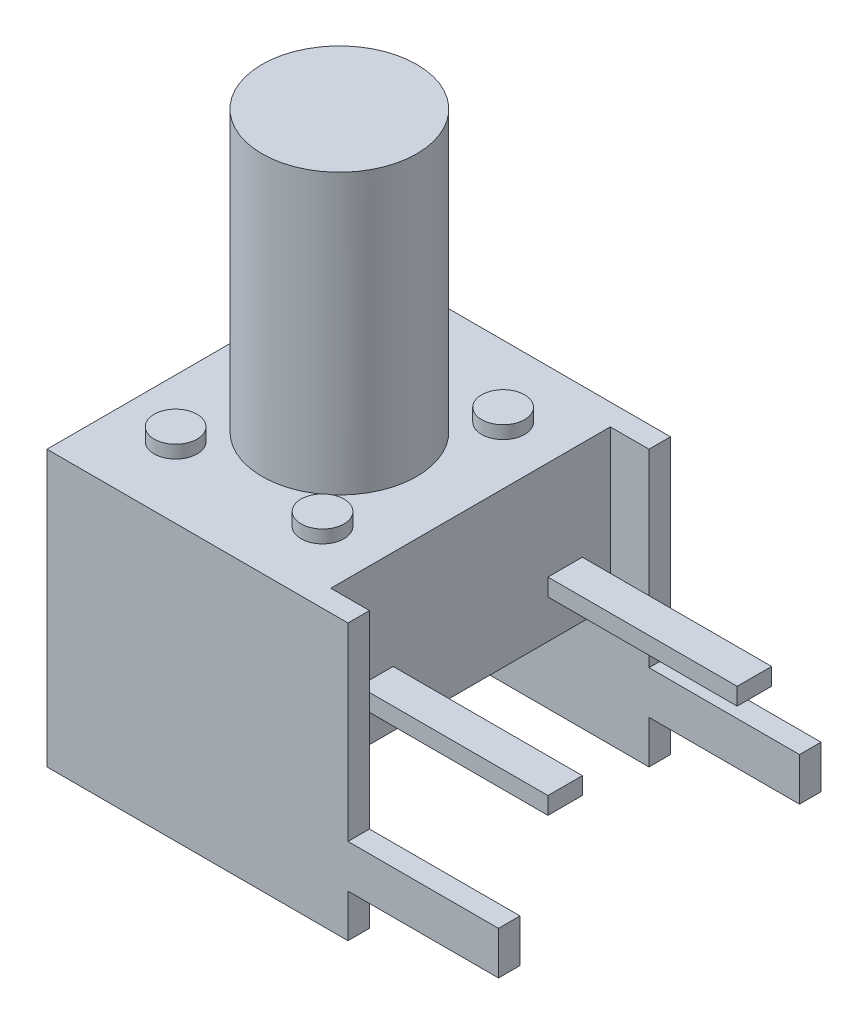
ISO-10303-21;
HEADER;
FILE_DESCRIPTION(('STEP AP214'),'2;1');
FILE_NAME('part.step','',(''),(''),'','','');
FILE_SCHEMA(('AUTOMOTIVE_DESIGN { 1 0 10303 214 1 1 1 1 }'));
ENDSEC;
DATA;
#1=APPLICATION_CONTEXT('core data for automotive mechanical design processes');
#2=APPLICATION_PROTOCOL_DEFINITION('international standard','automotive_design',2000,#1);
#3=PRODUCT_CONTEXT('',#1,'mechanical');
#4=PRODUCT('Part','Part','',(#3));
#5=PRODUCT_RELATED_PRODUCT_CATEGORY('part','',(#4));
#6=PRODUCT_DEFINITION_FORMATION('','',#4);
#7=PRODUCT_DEFINITION_CONTEXT('part definition',#1,'design');
#8=PRODUCT_DEFINITION('design','',#6,#7);
#9=PRODUCT_DEFINITION_SHAPE('','',#8);
#10=(LENGTH_UNIT() NAMED_UNIT(*) SI_UNIT(.MILLI.,.METRE.));
#11=(NAMED_UNIT(*) PLANE_ANGLE_UNIT() SI_UNIT($,.RADIAN.));
#12=(NAMED_UNIT(*) SI_UNIT($,.STERADIAN.) SOLID_ANGLE_UNIT());
#13=UNCERTAINTY_MEASURE_WITH_UNIT(LENGTH_MEASURE(1.E-05),#10,'distance_accuracy_value','');
#14=(GEOMETRIC_REPRESENTATION_CONTEXT(3) GLOBAL_UNCERTAINTY_ASSIGNED_CONTEXT((#13)) GLOBAL_UNIT_ASSIGNED_CONTEXT((#10,
#11,#12)) REPRESENTATION_CONTEXT('',''));
#15=CARTESIAN_POINT('',(0.,0.,0.));
#16=DIRECTION('',(0.,0.,1.));
#17=DIRECTION('',(1.,0.,0.));
#18=AXIS2_PLACEMENT_3D('',#15,#16,#17);
#19=CARTESIAN_POINT('',(3.95,0.,0.));
#20=DIRECTION('',(1.,0.,0.));
#21=DIRECTION('',(0.,0.,-1.));
#22=AXIS2_PLACEMENT_3D('',#19,#20,#21);
#23=PLANE('',#22);
#24=DIRECTION('',(0.,1.,0.));
#25=VECTOR('',#24,1.);
#26=CARTESIAN_POINT('',(3.95,3.6,-3.75));
#27=LINE('',#26,#25);
#28=CARTESIAN_POINT('',(3.95,-2.8,-3.75));
#29=VERTEX_POINT('',#28);
#30=CARTESIAN_POINT('',(3.95,-1.8,-3.75));
#31=VERTEX_POINT('',#30);
#32=EDGE_CURVE('E294',#29,#31,#27,.T.);
#33=ORIENTED_EDGE('',*,*,#32,.T.);
#34=DIRECTION('',(0.,0.,1.));
#35=VECTOR('',#34,1.);
#36=CARTESIAN_POINT('',(3.95,-1.8,0.));
#37=LINE('',#36,#35);
#38=CARTESIAN_POINT('',(3.95,-1.8,-3.25));
#39=VERTEX_POINT('',#38);
#40=EDGE_CURVE('E11',#31,#39,#37,.T.);
#41=ORIENTED_EDGE('',*,*,#40,.T.);
#42=DIRECTION('',(0.,1.,0.));
#43=VECTOR('',#42,1.);
#44=CARTESIAN_POINT('',(3.95,3.6,-3.25));
#45=LINE('',#44,#43);
#46=CARTESIAN_POINT('',(3.95,-2.8,-3.25));
#47=VERTEX_POINT('',#46);
#48=EDGE_CURVE('E300',#47,#39,#45,.T.);
#49=ORIENTED_EDGE('',*,*,#48,.F.);
#50=DIRECTION('',(0.,0.,-1.));
#51=VECTOR('',#50,1.);
#52=CARTESIAN_POINT('',(3.95,-2.8,3.75));
#53=LINE('',#52,#51);
#54=EDGE_CURVE('E289',#47,#29,#53,.T.);
#55=ORIENTED_EDGE('',*,*,#54,.T.);
#56=EDGE_LOOP('',(#33,#41,#49,#55));
#57=FACE_BOUND('',#56,.T.);
#58=ADVANCED_FACE('F35',(#57),#23,.T.);
#59=CARTESIAN_POINT('',(3.95,0.,0.));
#60=DIRECTION('',(-1.,0.,0.));
#61=DIRECTION('',(0.,0.,1.));
#62=AXIS2_PLACEMENT_3D('',#59,#60,#61);
#63=PLANE('',#62);
#64=DIRECTION('',(0.,0.,1.));
#65=VECTOR('',#64,1.);
#66=CARTESIAN_POINT('',(3.95,-0.800000000000001,0.));
#67=LINE('',#66,#65);
#68=CARTESIAN_POINT('',(3.95,-0.800000000000001,3.25));
#69=VERTEX_POINT('',#68);
#70=CARTESIAN_POINT('',(3.95,-0.800000000000001,3.75));
#71=VERTEX_POINT('',#70);
#72=EDGE_CURVE('E434',#69,#71,#67,.T.);
#73=ORIENTED_EDGE('',*,*,#72,.F.);
#74=DIRECTION('',(0.,1.,0.));
#75=VECTOR('',#74,1.);
#76=CARTESIAN_POINT('',(3.95,3.6,3.25));
#77=LINE('',#76,#75);
#78=CARTESIAN_POINT('',(3.95,3.6,3.25));
#79=VERTEX_POINT('',#78);
#80=EDGE_CURVE('E261',#69,#79,#77,.T.);
#81=ORIENTED_EDGE('',*,*,#80,.T.);
#82=DIRECTION('',(0.,0.,1.));
#83=VECTOR('',#82,1.);
#84=CARTESIAN_POINT('',(3.95,3.6,3.75));
#85=LINE('',#84,#83);
#86=CARTESIAN_POINT('',(3.95,3.6,3.75));
#87=VERTEX_POINT('',#86);
#88=EDGE_CURVE('E277',#79,#87,#85,.T.);
#89=ORIENTED_EDGE('',*,*,#88,.T.);
#90=DIRECTION('',(0.,1.,0.));
#91=VECTOR('',#90,1.);
#92=CARTESIAN_POINT('',(3.95,3.6,3.75));
#93=LINE('',#92,#91);
#94=EDGE_CURVE('E280',#71,#87,#93,.T.);
#95=ORIENTED_EDGE('',*,*,#94,.F.);
#96=EDGE_LOOP('',(#73,#81,#89,#95));
#97=FACE_BOUND('',#96,.T.);
#98=ADVANCED_FACE('F470',(#97),#63,.F.);
#99=CARTESIAN_POINT('',(3.05,3.6,3.75));
#100=DIRECTION('',(-1.,0.,0.));
#101=DIRECTION('',(0.,0.,1.));
#102=AXIS2_PLACEMENT_3D('',#99,#100,#101);
#103=PLANE('',#102);
#104=DIRECTION('',(0.,0.,-1.));
#105=VECTOR('',#104,1.);
#106=CARTESIAN_POINT('',(3.05,0.899999999999997,2.6));
#107=LINE('',#106,#105);
#108=CARTESIAN_POINT('',(3.05,0.899999999999997,2.6));
#109=VERTEX_POINT('',#108);
#110=CARTESIAN_POINT('',(3.05,0.899999999999997,1.8));
#111=VERTEX_POINT('',#110);
#112=EDGE_CURVE('E352',#109,#111,#107,.T.);
#113=ORIENTED_EDGE('',*,*,#112,.F.);
#114=DIRECTION('',(0.,1.,0.));
#115=VECTOR('',#114,1.);
#116=CARTESIAN_POINT('',(3.05,0.899999999999997,2.6));
#117=LINE('',#116,#115);
#118=CARTESIAN_POINT('',(3.05,1.3,2.6));
#119=VERTEX_POINT('',#118);
#120=EDGE_CURVE('E339',#109,#119,#117,.T.);
#121=ORIENTED_EDGE('',*,*,#120,.T.);
#122=DIRECTION('',(0.,0.,-1.));
#123=VECTOR('',#122,1.);
#124=CARTESIAN_POINT('',(3.05,1.3,2.6));
#125=LINE('',#124,#123);
#126=CARTESIAN_POINT('',(3.05,1.3,1.8));
#127=VERTEX_POINT('',#126);
#128=EDGE_CURVE('E362',#119,#127,#125,.T.);
#129=ORIENTED_EDGE('',*,*,#128,.T.);
#130=DIRECTION('',(0.,1.,0.));
#131=VECTOR('',#130,1.);
#132=CARTESIAN_POINT('',(3.05,0.899999999999997,1.8));
#133=LINE('',#132,#131);
#134=EDGE_CURVE('E365',#111,#127,#133,.T.);
#135=ORIENTED_EDGE('',*,*,#134,.F.);
#136=EDGE_LOOP('',(#113,#121,#129,#135));
#137=FACE_BOUND('',#136,.T.);
#138=DIRECTION('',(0.,0.,-1.));
#139=VECTOR('',#138,1.);
#140=CARTESIAN_POINT('',(3.05,0.899999999999997,-1.8));
#141=LINE('',#140,#139);
#142=CARTESIAN_POINT('',(3.05,0.899999999999997,-1.8));
#143=VERTEX_POINT('',#142);
#144=CARTESIAN_POINT('',(3.05,0.899999999999997,-2.6));
#145=VERTEX_POINT('',#144);
#146=EDGE_CURVE('E328',#143,#145,#141,.T.);
#147=ORIENTED_EDGE('',*,*,#146,.F.);
#148=DIRECTION('',(0.,1.,0.));
#149=VECTOR('',#148,1.);
#150=CARTESIAN_POINT('',(3.05,0.899999999999997,-1.8));
#151=LINE('',#150,#149);
#152=CARTESIAN_POINT('',(3.05,1.3,-1.8));
#153=VERTEX_POINT('',#152);
#154=EDGE_CURVE('E336',#143,#153,#151,.T.);
#155=ORIENTED_EDGE('',*,*,#154,.T.);
#156=DIRECTION('',(0.,0.,-1.));
#157=VECTOR('',#156,1.);
#158=CARTESIAN_POINT('',(3.05,1.3,-1.8));
#159=LINE('',#158,#157);
#160=CARTESIAN_POINT('',(3.05,1.3,-2.6));
#161=VERTEX_POINT('',#160);
#162=EDGE_CURVE('E333',#153,#161,#159,.T.);
#163=ORIENTED_EDGE('',*,*,#162,.T.);
#164=DIRECTION('',(0.,1.,0.));
#165=VECTOR('',#164,1.);
#166=CARTESIAN_POINT('',(3.05,0.899999999999997,-2.6));
#167=LINE('',#166,#165);
#168=EDGE_CURVE('E330',#145,#161,#167,.T.);
#169=ORIENTED_EDGE('',*,*,#168,.F.);
#170=EDGE_LOOP('',(#147,#155,#163,#169));
#171=FACE_BOUND('',#170,.T.);
#172=DIRECTION('',(0.,1.,0.));
#173=VECTOR('',#172,1.);
#174=CARTESIAN_POINT('',(3.05,3.6,3.25));
#175=LINE('',#174,#173);
#176=CARTESIAN_POINT('',(3.05,0.,3.25));
#177=VERTEX_POINT('',#176);
#178=CARTESIAN_POINT('',(3.05,3.6,3.25));
#179=VERTEX_POINT('',#178);
#180=EDGE_CURVE('E273',#177,#179,#175,.T.);
#181=ORIENTED_EDGE('',*,*,#180,.F.);
#182=DIRECTION('',(0.,0.,-1.));
#183=VECTOR('',#182,1.);
#184=CARTESIAN_POINT('',(3.05,0.,3.75));
#185=LINE('',#184,#183);
#186=CARTESIAN_POINT('',(3.05,0.,-3.25));
#187=VERTEX_POINT('',#186);
#188=EDGE_CURVE('E413',#177,#187,#185,.T.);
#189=ORIENTED_EDGE('',*,*,#188,.T.);
#190=DIRECTION('',(0.,1.,0.));
#191=VECTOR('',#190,1.);
#192=CARTESIAN_POINT('',(3.05,3.6,-3.25));
#193=LINE('',#192,#191);
#194=CARTESIAN_POINT('',(3.05,3.6,-3.25));
#195=VERTEX_POINT('',#194);
#196=EDGE_CURVE('E314',#187,#195,#193,.T.);
#197=ORIENTED_EDGE('',*,*,#196,.T.);
#198=DIRECTION('',(0.,0.,-1.));
#199=VECTOR('',#198,1.);
#200=CARTESIAN_POINT('',(3.05,3.6,3.75));
#201=LINE('',#200,#199);
#202=EDGE_CURVE('E416',#179,#195,#201,.T.);
#203=ORIENTED_EDGE('',*,*,#202,.F.);
#204=EDGE_LOOP('',(#181,#189,#197,#203));
#205=FACE_BOUND('',#204,.T.);
#206=ADVANCED_FACE('F474',(#137,#171,#205),#103,.F.);
#207=CARTESIAN_POINT('',(0.,0.,0.));
#208=DIRECTION('',(0.,-1.,0.));
#209=DIRECTION('',(0.,0.,-1.));
#210=AXIS2_PLACEMENT_3D('',#207,#208,#209);
#211=PLANE('',#210);
#212=ORIENTED_EDGE('',*,*,#188,.F.);
#213=DIRECTION('',(-1.,0.,0.));
#214=VECTOR('',#213,1.);
#215=CARTESIAN_POINT('',(0.,0.,3.25));
#216=LINE('',#215,#214);
#217=CARTESIAN_POINT('',(-3.05,0.,3.25));
#218=VERTEX_POINT('',#217);
#219=EDGE_CURVE('E428',#177,#218,#216,.T.);
#220=ORIENTED_EDGE('',*,*,#219,.T.);
#221=DIRECTION('',(0.,0.,-1.));
#222=VECTOR('',#221,1.);
#223=CARTESIAN_POINT('',(-3.05,0.,3.75));
#224=LINE('',#223,#222);
#225=CARTESIAN_POINT('',(-3.05,0.,-3.25));
#226=VERTEX_POINT('',#225);
#227=EDGE_CURVE('E404',#218,#226,#224,.T.);
#228=ORIENTED_EDGE('',*,*,#227,.T.);
#229=DIRECTION('',(-1.,0.,0.));
#230=VECTOR('',#229,1.);
#231=CARTESIAN_POINT('',(0.,0.,-3.25));
#232=LINE('',#231,#230);
#233=EDGE_CURVE('E408',#187,#226,#232,.T.);
#234=ORIENTED_EDGE('',*,*,#233,.F.);
#235=EDGE_LOOP('',(#212,#220,#228,#234));
#236=FACE_BOUND('',#235,.T.);
#237=ADVANCED_FACE('F480',(#236),#211,.T.);
#238=CARTESIAN_POINT('',(-3.05,3.6,3.75));
#239=DIRECTION('',(-1.,0.,0.));
#240=DIRECTION('',(0.,0.,1.));
#241=AXIS2_PLACEMENT_3D('',#238,#239,#240);
#242=PLANE('',#241);
#243=DIRECTION('',(0.,0.,-1.));
#244=VECTOR('',#243,1.);
#245=CARTESIAN_POINT('',(-3.05,3.6,3.75));
#246=LINE('',#245,#244);
#247=CARTESIAN_POINT('',(-3.05,3.6,3.75));
#248=VERTEX_POINT('',#247);
#249=CARTESIAN_POINT('',(-3.05,3.6,-3.75));
#250=VERTEX_POINT('',#249);
#251=EDGE_CURVE('E410',#248,#250,#246,.T.);
#252=ORIENTED_EDGE('',*,*,#251,.T.);
#253=DIRECTION('',(0.,-1.,0.));
#254=VECTOR('',#253,1.);
#255=CARTESIAN_POINT('',(-3.05,3.6,-3.75));
#256=LINE('',#255,#254);
#257=CARTESIAN_POINT('',(-3.05,-2.8,-3.75));
#258=VERTEX_POINT('',#257);
#259=EDGE_CURVE('E421',#250,#258,#256,.T.);
#260=ORIENTED_EDGE('',*,*,#259,.T.);
#261=DIRECTION('',(0.,0.,-1.));
#262=VECTOR('',#261,1.);
#263=CARTESIAN_POINT('',(-3.05,-2.8,3.75));
#264=LINE('',#263,#262);
#265=CARTESIAN_POINT('',(-3.05,-2.8,-3.25));
#266=VERTEX_POINT('',#265);
#267=EDGE_CURVE('E288',#266,#258,#264,.T.);
#268=ORIENTED_EDGE('',*,*,#267,.F.);
#269=DIRECTION('',(0.,1.,0.));
#270=VECTOR('',#269,1.);
#271=CARTESIAN_POINT('',(-3.05,3.6,-3.25));
#272=LINE('',#271,#270);
#273=EDGE_CURVE('E293',#266,#226,#272,.T.);
#274=ORIENTED_EDGE('',*,*,#273,.T.);
#275=ORIENTED_EDGE('',*,*,#227,.F.);
#276=DIRECTION('',(0.,1.,0.));
#277=VECTOR('',#276,1.);
#278=CARTESIAN_POINT('',(-3.05,3.6,3.25));
#279=LINE('',#278,#277);
#280=CARTESIAN_POINT('',(-3.05,-2.8,3.25));
#281=VERTEX_POINT('',#280);
#282=EDGE_CURVE('E266',#281,#218,#279,.T.);
#283=ORIENTED_EDGE('',*,*,#282,.F.);
#284=DIRECTION('',(0.,0.,1.));
#285=VECTOR('',#284,1.);
#286=CARTESIAN_POINT('',(-3.05,-2.8,3.75));
#287=LINE('',#286,#285);
#288=CARTESIAN_POINT('',(-3.05,-2.8,3.75));
#289=VERTEX_POINT('',#288);
#290=EDGE_CURVE('E269',#281,#289,#287,.T.);
#291=ORIENTED_EDGE('',*,*,#290,.T.);
#292=DIRECTION('',(0.,-1.,0.));
#293=VECTOR('',#292,1.);
#294=CARTESIAN_POINT('',(-3.05,3.6,3.75));
#295=LINE('',#294,#293);
#296=EDGE_CURVE('E409',#248,#289,#295,.T.);
#297=ORIENTED_EDGE('',*,*,#296,.F.);
#298=EDGE_LOOP('',(#252,#260,#268,#274,#275,#283,#291,#297));
#299=FACE_BOUND('',#298,.T.);
#300=ADVANCED_FACE('F37',(#299),#242,.T.);
#301=CARTESIAN_POINT('',(-3.05,3.6,3.75));
#302=DIRECTION('',(0.,0.,-1.));
#303=DIRECTION('',(-1.,0.,0.));
#304=AXIS2_PLACEMENT_3D('',#301,#302,#303);
#305=PLANE('',#304);
#306=CARTESIAN_POINT('',(3.95,-2.8,3.75));
#307=VERTEX_POINT('',#306);
#308=CARTESIAN_POINT('',(3.95,-1.8,3.75));
#309=VERTEX_POINT('',#308);
#310=EDGE_CURVE('E281',#307,#309,#93,.T.);
#311=ORIENTED_EDGE('',*,*,#310,.T.);
#312=DIRECTION('',(-1.,0.,0.));
#313=VECTOR('',#312,1.);
#314=CARTESIAN_POINT('',(8.5680339887499,-1.8,3.75));
#315=LINE('',#314,#313);
#316=CARTESIAN_POINT('',(7.45,-1.8,3.75));
#317=VERTEX_POINT('',#316);
#318=EDGE_CURVE('E252',#317,#309,#315,.T.);
#319=ORIENTED_EDGE('',*,*,#318,.F.);
#320=DIRECTION('',(0.,1.,0.));
#321=VECTOR('',#320,1.);
#322=CARTESIAN_POINT('',(7.45,-0.800000000000001,3.75));
#323=LINE('',#322,#321);
#324=CARTESIAN_POINT('',(7.45,-0.800000000000001,3.75));
#325=VERTEX_POINT('',#324);
#326=EDGE_CURVE('E238',#317,#325,#323,.T.);
#327=ORIENTED_EDGE('',*,*,#326,.T.);
#328=DIRECTION('',(-1.,0.,0.));
#329=VECTOR('',#328,1.);
#330=CARTESIAN_POINT('',(8.5680339887499,-0.800000000000001,3.75));
#331=LINE('',#330,#329);
#332=EDGE_CURVE('E249',#325,#71,#331,.T.);
#333=ORIENTED_EDGE('',*,*,#332,.T.);
#334=ORIENTED_EDGE('',*,*,#94,.T.);
#335=DIRECTION('',(1.,0.,0.));
#336=VECTOR('',#335,1.);
#337=CARTESIAN_POINT('',(-3.05,3.6,3.75));
#338=LINE('',#337,#336);
#339=EDGE_CURVE('E418',#248,#87,#338,.T.);
#340=ORIENTED_EDGE('',*,*,#339,.F.);
#341=ORIENTED_EDGE('',*,*,#296,.T.);
#342=DIRECTION('',(-1.,0.,0.));
#343=VECTOR('',#342,1.);
#344=CARTESIAN_POINT('',(3.95,-2.8,3.75));
#345=LINE('',#344,#343);
#346=EDGE_CURVE('E258',#307,#289,#345,.T.);
#347=ORIENTED_EDGE('',*,*,#346,.F.);
#348=EDGE_LOOP('',(#311,#319,#327,#333,#334,#340,#341,#347));
#349=FACE_BOUND('',#348,.T.);
#350=ADVANCED_FACE('F508',(#349),#305,.F.);
#351=CARTESIAN_POINT('',(-3.05,3.6,-3.75));
#352=DIRECTION('',(0.,0.,-1.));
#353=DIRECTION('',(-1.,0.,0.));
#354=AXIS2_PLACEMENT_3D('',#351,#352,#353);
#355=PLANE('',#354);
#356=DIRECTION('',(-1.,0.,0.));
#357=VECTOR('',#356,1.);
#358=CARTESIAN_POINT('',(8.5680339887499,-1.8,-3.75));
#359=LINE('',#358,#357);
#360=CARTESIAN_POINT('',(7.45,-1.8,-3.75));
#361=VERTEX_POINT('',#360);
#362=EDGE_CURVE('E220',#361,#31,#359,.T.);
#363=ORIENTED_EDGE('',*,*,#362,.T.);
#364=ORIENTED_EDGE('',*,*,#32,.F.);
#365=DIRECTION('',(-1.,0.,0.));
#366=VECTOR('',#365,1.);
#367=CARTESIAN_POINT('',(3.95,-2.8,-3.75));
#368=LINE('',#367,#366);
#369=EDGE_CURVE('E311',#29,#258,#368,.T.);
#370=ORIENTED_EDGE('',*,*,#369,.T.);
#371=ORIENTED_EDGE('',*,*,#259,.F.);
#372=DIRECTION('',(1.,0.,0.));
#373=VECTOR('',#372,1.);
#374=CARTESIAN_POINT('',(-3.05,3.6,-3.75));
#375=LINE('',#374,#373);
#376=CARTESIAN_POINT('',(3.95,3.6,-3.75));
#377=VERTEX_POINT('',#376);
#378=EDGE_CURVE('E412',#250,#377,#375,.T.);
#379=ORIENTED_EDGE('',*,*,#378,.T.);
#380=CARTESIAN_POINT('',(3.95,-0.8,-3.75));
#381=VERTEX_POINT('',#380);
#382=EDGE_CURVE('E292',#381,#377,#27,.T.);
#383=ORIENTED_EDGE('',*,*,#382,.F.);
#384=DIRECTION('',(-1.,0.,0.));
#385=VECTOR('',#384,1.);
#386=CARTESIAN_POINT('',(8.5680339887499,-0.800000000000001,-3.75));
#387=LINE('',#386,#385);
#388=CARTESIAN_POINT('',(7.45,-0.800000000000001,-3.75));
#389=VERTEX_POINT('',#388);
#390=EDGE_CURVE('E222',#389,#381,#387,.T.);
#391=ORIENTED_EDGE('',*,*,#390,.F.);
#392=DIRECTION('',(0.,1.,0.));
#393=VECTOR('',#392,1.);
#394=CARTESIAN_POINT('',(7.45,-0.800000000000001,-3.75));
#395=LINE('',#394,#393);
#396=EDGE_CURVE('E208',#361,#389,#395,.T.);
#397=ORIENTED_EDGE('',*,*,#396,.F.);
#398=EDGE_LOOP('',(#363,#364,#370,#371,#379,#383,#391,#397));
#399=FACE_BOUND('',#398,.T.);
#400=ADVANCED_FACE('F219',(#399),#355,.T.);
#401=CARTESIAN_POINT('',(0.,3.6,0.));
#402=DIRECTION('',(0.,-1.,0.));
#403=DIRECTION('',(0.,0.,-1.));
#404=AXIS2_PLACEMENT_3D('',#401,#402,#403);
#405=PLANE('',#404);
#406=ORIENTED_EDGE('',*,*,#339,.T.);
#407=ORIENTED_EDGE('',*,*,#88,.F.);
#408=DIRECTION('',(-1.,0.,0.));
#409=VECTOR('',#408,1.);
#410=CARTESIAN_POINT('',(3.95,3.6,3.25));
#411=LINE('',#410,#409);
#412=EDGE_CURVE('E262',#79,#179,#411,.T.);
#413=ORIENTED_EDGE('',*,*,#412,.T.);
#414=ORIENTED_EDGE('',*,*,#202,.T.);
#415=DIRECTION('',(-1.,0.,0.));
#416=VECTOR('',#415,1.);
#417=CARTESIAN_POINT('',(3.95,3.6,-3.25));
#418=LINE('',#417,#416);
#419=CARTESIAN_POINT('',(3.95,3.6,-3.25));
#420=VERTEX_POINT('',#419);
#421=EDGE_CURVE('E308',#420,#195,#418,.T.);
#422=ORIENTED_EDGE('',*,*,#421,.F.);
#423=DIRECTION('',(0.,0.,-1.));
#424=VECTOR('',#423,1.);
#425=CARTESIAN_POINT('',(3.95,3.6,3.75));
#426=LINE('',#425,#424);
#427=EDGE_CURVE('E296',#420,#377,#426,.T.);
#428=ORIENTED_EDGE('',*,*,#427,.T.);
#429=ORIENTED_EDGE('',*,*,#378,.F.);
#430=ORIENTED_EDGE('',*,*,#251,.F.);
#431=EDGE_LOOP('',(#406,#407,#413,#414,#422,#428,#429,#430));
#432=FACE_BOUND('',#431,.T.);
#433=CARTESIAN_POINT('',(0.,3.6,0.));
#434=DIRECTION('',(0.,-1.,0.));
#435=DIRECTION('',(0.,0.,-1.));
#436=AXIS2_PLACEMENT_3D('',#433,#434,#435);
#437=CIRCLE('',#436,1.8);
#438=CARTESIAN_POINT('',(0.,3.6,-1.8));
#439=VERTEX_POINT('',#438);
#440=EDGE_CURVE('E405',#439,#439,#437,.F.);
#441=ORIENTED_EDGE('',*,*,#440,.F.);
#442=EDGE_LOOP('',(#441));
#443=FACE_BOUND('',#442,.T.);
#444=CARTESIAN_POINT('',(-1.708,3.6,-2.1));
#445=DIRECTION('',(0.,-1.,0.));
#446=DIRECTION('',(0.,0.,-1.));
#447=AXIS2_PLACEMENT_3D('',#444,#445,#446);
#448=CIRCLE('',#447,0.5);
#449=CARTESIAN_POINT('',(-1.708,3.6,-2.6));
#450=VERTEX_POINT('',#449);
#451=EDGE_CURVE('E393',#450,#450,#448,.T.);
#452=ORIENTED_EDGE('',*,*,#451,.T.);
#453=EDGE_LOOP('',(#452));
#454=FACE_BOUND('',#453,.T.);
#455=CARTESIAN_POINT('',(-1.708,3.6,2.1));
#456=DIRECTION('',(0.,-1.,0.));
#457=DIRECTION('',(0.,0.,-1.));
#458=AXIS2_PLACEMENT_3D('',#455,#456,#457);
#459=CIRCLE('',#458,0.5);
#460=CARTESIAN_POINT('',(-1.708,3.6,1.6));
#461=VERTEX_POINT('',#460);
#462=EDGE_CURVE('E390',#461,#461,#459,.T.);
#463=ORIENTED_EDGE('',*,*,#462,.T.);
#464=EDGE_LOOP('',(#463));
#465=FACE_BOUND('',#464,.T.);
#466=CARTESIAN_POINT('',(1.708,3.6,-2.1));
#467=DIRECTION('',(0.,-1.,0.));
#468=DIRECTION('',(0.,0.,-1.));
#469=AXIS2_PLACEMENT_3D('',#466,#467,#468);
#470=CIRCLE('',#469,0.5);
#471=CARTESIAN_POINT('',(1.708,3.6,-2.6));
#472=VERTEX_POINT('',#471);
#473=EDGE_CURVE('E384',#472,#472,#470,.T.);
#474=ORIENTED_EDGE('',*,*,#473,.T.);
#475=EDGE_LOOP('',(#474));
#476=FACE_BOUND('',#475,.T.);
#477=CARTESIAN_POINT('',(1.708,3.6,2.1));
#478=DIRECTION('',(0.,-1.,0.));
#479=DIRECTION('',(0.,0.,-1.));
#480=AXIS2_PLACEMENT_3D('',#477,#478,#479);
#481=CIRCLE('',#480,0.5);
#482=CARTESIAN_POINT('',(1.708,3.6,1.6));
#483=VERTEX_POINT('',#482);
#484=EDGE_CURVE('E378',#483,#483,#481,.T.);
#485=ORIENTED_EDGE('',*,*,#484,.T.);
#486=EDGE_LOOP('',(#485));
#487=FACE_BOUND('',#486,.T.);
#488=ADVANCED_FACE('F452',(#432,#443,#454,#465,#476,#487),#405,.F.);
#489=CARTESIAN_POINT('',(0.,10.1,0.));
#490=DIRECTION('',(0.,-1.,0.));
#491=DIRECTION('',(0.,0.,-1.));
#492=AXIS2_PLACEMENT_3D('',#489,#490,#491);
#493=CYLINDRICAL_SURFACE('',#492,1.8);
#494=CARTESIAN_POINT('',(0.,10.1,0.));
#495=DIRECTION('',(0.,1.,0.));
#496=DIRECTION('',(0.,0.,1.));
#497=AXIS2_PLACEMENT_3D('',#494,#495,#496);
#498=CIRCLE('',#497,1.8);
#499=CARTESIAN_POINT('',(0.,10.1,1.8));
#500=VERTEX_POINT('',#499);
#501=EDGE_CURVE('E399',#500,#500,#498,.T.);
#502=ORIENTED_EDGE('',*,*,#501,.F.);
#503=EDGE_LOOP('',(#502));
#504=FACE_BOUND('',#503,.T.);
#505=ORIENTED_EDGE('',*,*,#440,.T.);
#506=EDGE_LOOP('',(#505));
#507=FACE_BOUND('',#506,.T.);
#508=ADVANCED_FACE('F638',(#504,#507),#493,.T.);
#509=CARTESIAN_POINT('',(0.,10.1,0.));
#510=DIRECTION('',(0.,1.,0.));
#511=DIRECTION('',(0.,0.,1.));
#512=AXIS2_PLACEMENT_3D('',#509,#510,#511);
#513=PLANE('',#512);
#514=ORIENTED_EDGE('',*,*,#501,.T.);
#515=EDGE_LOOP('',(#514));
#516=FACE_BOUND('',#515,.T.);
#517=ADVANCED_FACE('F839',(#516),#513,.T.);
#518=CARTESIAN_POINT('',(-1.708,3.9,-2.1));
#519=DIRECTION('',(0.,-1.,0.));
#520=DIRECTION('',(0.,0.,-1.));
#521=AXIS2_PLACEMENT_3D('',#518,#519,#520);
#522=CYLINDRICAL_SURFACE('',#521,0.5);
#523=CARTESIAN_POINT('',(-1.708,3.9,-2.1));
#524=DIRECTION('',(0.,-1.,0.));
#525=DIRECTION('',(0.,0.,-1.));
#526=AXIS2_PLACEMENT_3D('',#523,#524,#525);
#527=CIRCLE('',#526,0.5);
#528=CARTESIAN_POINT('',(-1.708,3.9,-2.6));
#529=VERTEX_POINT('',#528);
#530=EDGE_CURVE('E396',#529,#529,#527,.T.);
#531=ORIENTED_EDGE('',*,*,#530,.T.);
#532=EDGE_LOOP('',(#531));
#533=FACE_BOUND('',#532,.T.);
#534=ORIENTED_EDGE('',*,*,#451,.F.);
#535=EDGE_LOOP('',(#534));
#536=FACE_BOUND('',#535,.T.);
#537=ADVANCED_FACE('F829',(#533,#536),#522,.T.);
#538=CARTESIAN_POINT('',(-1.708,3.9,-2.1));
#539=DIRECTION('',(0.,-1.,0.));
#540=DIRECTION('',(0.,0.,-1.));
#541=AXIS2_PLACEMENT_3D('',#538,#539,#540);
#542=PLANE('',#541);
#543=ORIENTED_EDGE('',*,*,#530,.F.);
#544=EDGE_LOOP('',(#543));
#545=FACE_BOUND('',#544,.T.);
#546=ADVANCED_FACE('F819',(#545),#542,.F.);
#547=CARTESIAN_POINT('',(-1.708,3.9,2.1));
#548=DIRECTION('',(0.,-1.,0.));
#549=DIRECTION('',(0.,0.,-1.));
#550=AXIS2_PLACEMENT_3D('',#547,#548,#549);
#551=CYLINDRICAL_SURFACE('',#550,0.5);
#552=CARTESIAN_POINT('',(-1.708,3.9,2.1));
#553=DIRECTION('',(0.,-1.,0.));
#554=DIRECTION('',(0.,0.,-1.));
#555=AXIS2_PLACEMENT_3D('',#552,#553,#554);
#556=CIRCLE('',#555,0.5);
#557=CARTESIAN_POINT('',(-1.708,3.9,1.6));
#558=VERTEX_POINT('',#557);
#559=EDGE_CURVE('E387',#558,#558,#556,.T.);
#560=ORIENTED_EDGE('',*,*,#559,.T.);
#561=EDGE_LOOP('',(#560));
#562=FACE_BOUND('',#561,.T.);
#563=ORIENTED_EDGE('',*,*,#462,.F.);
#564=EDGE_LOOP('',(#563));
#565=FACE_BOUND('',#564,.T.);
#566=ADVANCED_FACE('F809',(#562,#565),#551,.T.);
#567=CARTESIAN_POINT('',(-1.708,3.9,2.1));
#568=DIRECTION('',(0.,-1.,0.));
#569=DIRECTION('',(0.,0.,-1.));
#570=AXIS2_PLACEMENT_3D('',#567,#568,#569);
#571=PLANE('',#570);
#572=ORIENTED_EDGE('',*,*,#559,.F.);
#573=EDGE_LOOP('',(#572));
#574=FACE_BOUND('',#573,.T.);
#575=ADVANCED_FACE('F799',(#574),#571,.F.);
#576=CARTESIAN_POINT('',(1.708,3.9,-2.1));
#577=DIRECTION('',(0.,-1.,0.));
#578=DIRECTION('',(0.,0.,-1.));
#579=AXIS2_PLACEMENT_3D('',#576,#577,#578);
#580=CYLINDRICAL_SURFACE('',#579,0.5);
#581=CARTESIAN_POINT('',(1.708,3.9,-2.1));
#582=DIRECTION('',(0.,-1.,0.));
#583=DIRECTION('',(0.,0.,-1.));
#584=AXIS2_PLACEMENT_3D('',#581,#582,#583);
#585=CIRCLE('',#584,0.5);
#586=CARTESIAN_POINT('',(1.708,3.9,-2.6));
#587=VERTEX_POINT('',#586);
#588=EDGE_CURVE('E381',#587,#587,#585,.T.);
#589=ORIENTED_EDGE('',*,*,#588,.T.);
#590=EDGE_LOOP('',(#589));
#591=FACE_BOUND('',#590,.T.);
#592=ORIENTED_EDGE('',*,*,#473,.F.);
#593=EDGE_LOOP('',(#592));
#594=FACE_BOUND('',#593,.T.);
#595=ADVANCED_FACE('F789',(#591,#594),#580,.T.);
#596=CARTESIAN_POINT('',(1.708,3.9,-2.1));
#597=DIRECTION('',(0.,-1.,0.));
#598=DIRECTION('',(0.,0.,-1.));
#599=AXIS2_PLACEMENT_3D('',#596,#597,#598);
#600=PLANE('',#599);
#601=ORIENTED_EDGE('',*,*,#588,.F.);
#602=EDGE_LOOP('',(#601));
#603=FACE_BOUND('',#602,.T.);
#604=ADVANCED_FACE('F779',(#603),#600,.F.);
#605=CARTESIAN_POINT('',(1.708,3.9,2.1));
#606=DIRECTION('',(0.,-1.,0.));
#607=DIRECTION('',(0.,0.,-1.));
#608=AXIS2_PLACEMENT_3D('',#605,#606,#607);
#609=CYLINDRICAL_SURFACE('',#608,0.5);
#610=CARTESIAN_POINT('',(1.708,3.9,2.1));
#611=DIRECTION('',(0.,-1.,0.));
#612=DIRECTION('',(0.,0.,-1.));
#613=AXIS2_PLACEMENT_3D('',#610,#611,#612);
#614=CIRCLE('',#613,0.5);
#615=CARTESIAN_POINT('',(1.708,3.9,1.6));
#616=VERTEX_POINT('',#615);
#617=EDGE_CURVE('E370',#616,#616,#614,.T.);
#618=ORIENTED_EDGE('',*,*,#617,.T.);
#619=EDGE_LOOP('',(#618));
#620=FACE_BOUND('',#619,.T.);
#621=ORIENTED_EDGE('',*,*,#484,.F.);
#622=EDGE_LOOP('',(#621));
#623=FACE_BOUND('',#622,.T.);
#624=ADVANCED_FACE('F769',(#620,#623),#609,.T.);
#625=CARTESIAN_POINT('',(1.708,3.9,2.1));
#626=DIRECTION('',(0.,-1.,0.));
#627=DIRECTION('',(0.,0.,-1.));
#628=AXIS2_PLACEMENT_3D('',#625,#626,#627);
#629=PLANE('',#628);
#630=ORIENTED_EDGE('',*,*,#617,.F.);
#631=EDGE_LOOP('',(#630));
#632=FACE_BOUND('',#631,.T.);
#633=ADVANCED_FACE('F759',(#632),#629,.F.);
#634=CARTESIAN_POINT('',(7.45,0.899999999999997,2.6));
#635=DIRECTION('',(0.,0.,1.));
#636=DIRECTION('',(0.,-1.,0.));
#637=AXIS2_PLACEMENT_3D('',#634,#635,#636);
#638=PLANE('',#637);
#639=ORIENTED_EDGE('',*,*,#120,.F.);
#640=DIRECTION('',(-1.,0.,0.));
#641=VECTOR('',#640,1.);
#642=CARTESIAN_POINT('',(7.45,0.899999999999997,2.6));
#643=LINE('',#642,#641);
#644=CARTESIAN_POINT('',(7.45,0.899999999999997,2.6));
#645=VERTEX_POINT('',#644);
#646=EDGE_CURVE('E368',#645,#109,#643,.T.);
#647=ORIENTED_EDGE('',*,*,#646,.F.);
#648=DIRECTION('',(0.,1.,0.));
#649=VECTOR('',#648,1.);
#650=CARTESIAN_POINT('',(7.45,0.899999999999997,2.6));
#651=LINE('',#650,#649);
#652=CARTESIAN_POINT('',(7.45,1.3,2.6));
#653=VERTEX_POINT('',#652);
#654=EDGE_CURVE('E348',#645,#653,#651,.T.);
#655=ORIENTED_EDGE('',*,*,#654,.T.);
#656=DIRECTION('',(-1.,0.,0.));
#657=VECTOR('',#656,1.);
#658=CARTESIAN_POINT('',(7.45,1.3,2.6));
#659=LINE('',#658,#657);
#660=EDGE_CURVE('E359',#653,#119,#659,.T.);
#661=ORIENTED_EDGE('',*,*,#660,.T.);
#662=EDGE_LOOP('',(#639,#647,#655,#661));
#663=FACE_BOUND('',#662,.T.);
#664=ADVANCED_FACE('F749',(#663),#638,.T.);
#665=CARTESIAN_POINT('',(7.45,0.899999999999997,2.6));
#666=DIRECTION('',(0.,1.,0.));
#667=DIRECTION('',(0.,0.,1.));
#668=AXIS2_PLACEMENT_3D('',#665,#666,#667);
#669=PLANE('',#668);
#670=ORIENTED_EDGE('',*,*,#112,.T.);
#671=DIRECTION('',(-1.,0.,0.));
#672=VECTOR('',#671,1.);
#673=CARTESIAN_POINT('',(7.45,0.899999999999997,1.8));
#674=LINE('',#673,#672);
#675=CARTESIAN_POINT('',(7.45,0.899999999999997,1.8));
#676=VERTEX_POINT('',#675);
#677=EDGE_CURVE('E371',#676,#111,#674,.T.);
#678=ORIENTED_EDGE('',*,*,#677,.F.);
#679=DIRECTION('',(0.,0.,-1.));
#680=VECTOR('',#679,1.);
#681=CARTESIAN_POINT('',(7.45,0.899999999999997,2.6));
#682=LINE('',#681,#680);
#683=EDGE_CURVE('E357',#645,#676,#682,.T.);
#684=ORIENTED_EDGE('',*,*,#683,.F.);
#685=ORIENTED_EDGE('',*,*,#646,.T.);
#686=EDGE_LOOP('',(#670,#678,#684,#685));
#687=FACE_BOUND('',#686,.T.);
#688=ADVANCED_FACE('F739',(#687),#669,.F.);
#689=CARTESIAN_POINT('',(7.45,0.899999999999997,1.8));
#690=DIRECTION('',(0.,0.,1.));
#691=DIRECTION('',(0.,-1.,0.));
#692=AXIS2_PLACEMENT_3D('',#689,#690,#691);
#693=PLANE('',#692);
#694=ORIENTED_EDGE('',*,*,#134,.T.);
#695=DIRECTION('',(-1.,0.,0.));
#696=VECTOR('',#695,1.);
#697=CARTESIAN_POINT('',(7.45,1.3,1.8));
#698=LINE('',#697,#696);
#699=CARTESIAN_POINT('',(7.45,1.3,1.8));
#700=VERTEX_POINT('',#699);
#701=EDGE_CURVE('E374',#700,#127,#698,.T.);
#702=ORIENTED_EDGE('',*,*,#701,.F.);
#703=DIRECTION('',(0.,1.,0.));
#704=VECTOR('',#703,1.);
#705=CARTESIAN_POINT('',(7.45,0.899999999999997,1.8));
#706=LINE('',#705,#704);
#707=EDGE_CURVE('E355',#676,#700,#706,.T.);
#708=ORIENTED_EDGE('',*,*,#707,.F.);
#709=ORIENTED_EDGE('',*,*,#677,.T.);
#710=EDGE_LOOP('',(#694,#702,#708,#709));
#711=FACE_BOUND('',#710,.T.);
#712=ADVANCED_FACE('F729',(#711),#693,.F.);
#713=CARTESIAN_POINT('',(7.45,1.3,2.6));
#714=DIRECTION('',(0.,1.,0.));
#715=DIRECTION('',(0.,0.,1.));
#716=AXIS2_PLACEMENT_3D('',#713,#714,#715);
#717=PLANE('',#716);
#718=ORIENTED_EDGE('',*,*,#128,.F.);
#719=ORIENTED_EDGE('',*,*,#660,.F.);
#720=DIRECTION('',(0.,0.,-1.));
#721=VECTOR('',#720,1.);
#722=CARTESIAN_POINT('',(7.45,1.3,2.6));
#723=LINE('',#722,#721);
#724=EDGE_CURVE('E351',#653,#700,#723,.T.);
#725=ORIENTED_EDGE('',*,*,#724,.T.);
#726=ORIENTED_EDGE('',*,*,#701,.T.);
#727=EDGE_LOOP('',(#718,#719,#725,#726));
#728=FACE_BOUND('',#727,.T.);
#729=ADVANCED_FACE('F719',(#728),#717,.T.);
#730=CARTESIAN_POINT('',(7.45,0.,0.));
#731=DIRECTION('',(-1.,0.,0.));
#732=DIRECTION('',(0.,0.,1.));
#733=AXIS2_PLACEMENT_3D('',#730,#731,#732);
#734=PLANE('',#733);
#735=ORIENTED_EDGE('',*,*,#654,.F.);
#736=ORIENTED_EDGE('',*,*,#683,.T.);
#737=ORIENTED_EDGE('',*,*,#707,.T.);
#738=ORIENTED_EDGE('',*,*,#724,.F.);
#739=EDGE_LOOP('',(#735,#736,#737,#738));
#740=FACE_BOUND('',#739,.T.);
#741=ADVANCED_FACE('F709',(#740),#734,.F.);
#742=CARTESIAN_POINT('',(7.45,0.899999999999997,-1.8));
#743=DIRECTION('',(0.,0.,1.));
#744=DIRECTION('',(0.,-1.,0.));
#745=AXIS2_PLACEMENT_3D('',#742,#743,#744);
#746=PLANE('',#745);
#747=ORIENTED_EDGE('',*,*,#154,.F.);
#748=DIRECTION('',(-1.,0.,0.));
#749=VECTOR('',#748,1.);
#750=CARTESIAN_POINT('',(7.45,0.899999999999997,-1.8));
#751=LINE('',#750,#749);
#752=CARTESIAN_POINT('',(7.45,0.899999999999997,-1.8));
#753=VERTEX_POINT('',#752);
#754=EDGE_CURVE('E317',#753,#143,#751,.T.);
#755=ORIENTED_EDGE('',*,*,#754,.F.);
#756=DIRECTION('',(0.,1.,0.));
#757=VECTOR('',#756,1.);
#758=CARTESIAN_POINT('',(7.45,0.899999999999997,-1.8));
#759=LINE('',#758,#757);
#760=CARTESIAN_POINT('',(7.45,1.3,-1.8));
#761=VERTEX_POINT('',#760);
#762=EDGE_CURVE('E331',#753,#761,#759,.T.);
#763=ORIENTED_EDGE('',*,*,#762,.T.);
#764=DIRECTION('',(-1.,0.,0.));
#765=VECTOR('',#764,1.);
#766=CARTESIAN_POINT('',(7.45,1.3,-1.8));
#767=LINE('',#766,#765);
#768=EDGE_CURVE('E318',#761,#153,#767,.T.);
#769=ORIENTED_EDGE('',*,*,#768,.T.);
#770=EDGE_LOOP('',(#747,#755,#763,#769));
#771=FACE_BOUND('',#770,.T.);
#772=ADVANCED_FACE('F699',(#771),#746,.T.);
#773=CARTESIAN_POINT('',(7.45,0.899999999999997,-1.8));
#774=DIRECTION('',(0.,1.,0.));
#775=DIRECTION('',(0.,0.,1.));
#776=AXIS2_PLACEMENT_3D('',#773,#774,#775);
#777=PLANE('',#776);
#778=ORIENTED_EDGE('',*,*,#146,.T.);
#779=DIRECTION('',(-1.,0.,0.));
#780=VECTOR('',#779,1.);
#781=CARTESIAN_POINT('',(7.45,0.899999999999997,-2.6));
#782=LINE('',#781,#780);
#783=CARTESIAN_POINT('',(7.45,0.899999999999997,-2.6));
#784=VERTEX_POINT('',#783);
#785=EDGE_CURVE('E324',#784,#145,#782,.T.);
#786=ORIENTED_EDGE('',*,*,#785,.F.);
#787=DIRECTION('',(0.,0.,-1.));
#788=VECTOR('',#787,1.);
#789=CARTESIAN_POINT('',(7.45,0.899999999999997,-1.8));
#790=LINE('',#789,#788);
#791=EDGE_CURVE('E320',#753,#784,#790,.T.);
#792=ORIENTED_EDGE('',*,*,#791,.F.);
#793=ORIENTED_EDGE('',*,*,#754,.T.);
#794=EDGE_LOOP('',(#778,#786,#792,#793));
#795=FACE_BOUND('',#794,.T.);
#796=ADVANCED_FACE('F689',(#795),#777,.F.);
#797=CARTESIAN_POINT('',(7.45,0.899999999999997,-2.6));
#798=DIRECTION('',(0.,0.,1.));
#799=DIRECTION('',(0.,-1.,0.));
#800=AXIS2_PLACEMENT_3D('',#797,#798,#799);
#801=PLANE('',#800);
#802=ORIENTED_EDGE('',*,*,#168,.T.);
#803=DIRECTION('',(-1.,0.,0.));
#804=VECTOR('',#803,1.);
#805=CARTESIAN_POINT('',(7.45,1.3,-2.6));
#806=LINE('',#805,#804);
#807=CARTESIAN_POINT('',(7.45,1.3,-2.6));
#808=VERTEX_POINT('',#807);
#809=EDGE_CURVE('E321',#808,#161,#806,.T.);
#810=ORIENTED_EDGE('',*,*,#809,.F.);
#811=DIRECTION('',(0.,1.,0.));
#812=VECTOR('',#811,1.);
#813=CARTESIAN_POINT('',(7.45,0.899999999999997,-2.6));
#814=LINE('',#813,#812);
#815=EDGE_CURVE('E341',#784,#808,#814,.T.);
#816=ORIENTED_EDGE('',*,*,#815,.F.);
#817=ORIENTED_EDGE('',*,*,#785,.T.);
#818=EDGE_LOOP('',(#802,#810,#816,#817));
#819=FACE_BOUND('',#818,.T.);
#820=ADVANCED_FACE('F679',(#819),#801,.F.);
#821=CARTESIAN_POINT('',(7.45,1.3,-1.8));
#822=DIRECTION('',(0.,1.,0.));
#823=DIRECTION('',(0.,0.,1.));
#824=AXIS2_PLACEMENT_3D('',#821,#822,#823);
#825=PLANE('',#824);
#826=ORIENTED_EDGE('',*,*,#162,.F.);
#827=ORIENTED_EDGE('',*,*,#768,.F.);
#828=DIRECTION('',(0.,0.,-1.));
#829=VECTOR('',#828,1.);
#830=CARTESIAN_POINT('',(7.45,1.3,-1.8));
#831=LINE('',#830,#829);
#832=EDGE_CURVE('E343',#761,#808,#831,.T.);
#833=ORIENTED_EDGE('',*,*,#832,.T.);
#834=ORIENTED_EDGE('',*,*,#809,.T.);
#835=EDGE_LOOP('',(#826,#827,#833,#834));
#836=FACE_BOUND('',#835,.T.);
#837=ADVANCED_FACE('F669',(#836),#825,.T.);
#838=CARTESIAN_POINT('',(7.45,0.,0.));
#839=DIRECTION('',(-1.,0.,0.));
#840=DIRECTION('',(0.,0.,1.));
#841=AXIS2_PLACEMENT_3D('',#838,#839,#840);
#842=PLANE('',#841);
#843=ORIENTED_EDGE('',*,*,#762,.F.);
#844=ORIENTED_EDGE('',*,*,#791,.T.);
#845=ORIENTED_EDGE('',*,*,#815,.T.);
#846=ORIENTED_EDGE('',*,*,#832,.F.);
#847=EDGE_LOOP('',(#843,#844,#845,#846));
#848=FACE_BOUND('',#847,.T.);
#849=ADVANCED_FACE('F584',(#848),#842,.F.);
#850=CARTESIAN_POINT('',(3.95,3.6,-3.25));
#851=DIRECTION('',(0.,0.,1.));
#852=DIRECTION('',(0.,-1.,0.));
#853=AXIS2_PLACEMENT_3D('',#850,#851,#852);
#854=PLANE('',#853);
#855=ORIENTED_EDGE('',*,*,#48,.T.);
#856=DIRECTION('',(-1.,0.,0.));
#857=VECTOR('',#856,1.);
#858=CARTESIAN_POINT('',(8.5680339887499,-1.8,-3.25));
#859=LINE('',#858,#857);
#860=CARTESIAN_POINT('',(7.45,-1.8,-3.25));
#861=VERTEX_POINT('',#860);
#862=EDGE_CURVE('E224',#861,#39,#859,.T.);
#863=ORIENTED_EDGE('',*,*,#862,.F.);
#864=DIRECTION('',(0.,1.,0.));
#865=VECTOR('',#864,1.);
#866=CARTESIAN_POINT('',(7.45,-0.8,-3.25));
#867=LINE('',#866,#865);
#868=CARTESIAN_POINT('',(7.45,-0.8,-3.25));
#869=VERTEX_POINT('',#868);
#870=EDGE_CURVE('E211',#861,#869,#867,.T.);
#871=ORIENTED_EDGE('',*,*,#870,.T.);
#872=DIRECTION('',(-1.,0.,0.));
#873=VECTOR('',#872,1.);
#874=CARTESIAN_POINT('',(8.5680339887499,-0.8,-3.25));
#875=LINE('',#874,#873);
#876=CARTESIAN_POINT('',(3.95,-0.8,-3.25));
#877=VERTEX_POINT('',#876);
#878=EDGE_CURVE('E228',#869,#877,#875,.T.);
#879=ORIENTED_EDGE('',*,*,#878,.T.);
#880=EDGE_CURVE('E299',#877,#420,#45,.T.);
#881=ORIENTED_EDGE('',*,*,#880,.T.);
#882=ORIENTED_EDGE('',*,*,#421,.T.);
#883=ORIENTED_EDGE('',*,*,#196,.F.);
#884=ORIENTED_EDGE('',*,*,#233,.T.);
#885=ORIENTED_EDGE('',*,*,#273,.F.);
#886=DIRECTION('',(-1.,0.,0.));
#887=VECTOR('',#886,1.);
#888=CARTESIAN_POINT('',(3.95,-2.8,-3.25));
#889=LINE('',#888,#887);
#890=EDGE_CURVE('E302',#47,#266,#889,.T.);
#891=ORIENTED_EDGE('',*,*,#890,.F.);
#892=EDGE_LOOP('',(#855,#863,#871,#879,#881,#882,#883,#884,#885,#891));
#893=FACE_BOUND('',#892,.T.);
#894=ADVANCED_FACE('F439',(#893),#854,.T.);
#895=CARTESIAN_POINT('',(3.95,-2.8,3.75));
#896=DIRECTION('',(0.,1.,0.));
#897=DIRECTION('',(0.,0.,1.));
#898=AXIS2_PLACEMENT_3D('',#895,#896,#897);
#899=PLANE('',#898);
#900=ORIENTED_EDGE('',*,*,#267,.T.);
#901=ORIENTED_EDGE('',*,*,#369,.F.);
#902=ORIENTED_EDGE('',*,*,#54,.F.);
#903=ORIENTED_EDGE('',*,*,#890,.T.);
#904=EDGE_LOOP('',(#900,#901,#902,#903));
#905=FACE_BOUND('',#904,.T.);
#906=ADVANCED_FACE('F445',(#905),#899,.F.);
#907=DIRECTION('',(0.,0.,1.));
#908=VECTOR('',#907,1.);
#909=CARTESIAN_POINT('',(3.95,-0.8,0.));
#910=LINE('',#909,#908);
#911=EDGE_CURVE('E43',#381,#877,#910,.T.);
#912=ORIENTED_EDGE('',*,*,#911,.F.);
#913=ORIENTED_EDGE('',*,*,#382,.T.);
#914=ORIENTED_EDGE('',*,*,#427,.F.);
#915=ORIENTED_EDGE('',*,*,#880,.F.);
#916=EDGE_LOOP('',(#912,#913,#914,#915));
#917=FACE_BOUND('',#916,.T.);
#918=ADVANCED_FACE('F455',(#917),#23,.T.);
#919=CARTESIAN_POINT('',(3.95,3.6,3.25));
#920=DIRECTION('',(0.,0.,1.));
#921=DIRECTION('',(0.,-1.,0.));
#922=AXIS2_PLACEMENT_3D('',#919,#920,#921);
#923=PLANE('',#922);
#924=ORIENTED_EDGE('',*,*,#80,.F.);
#925=DIRECTION('',(-1.,0.,0.));
#926=VECTOR('',#925,1.);
#927=CARTESIAN_POINT('',(8.5680339887499,-0.800000000000001,3.25));
#928=LINE('',#927,#926);
#929=CARTESIAN_POINT('',(7.45,-0.800000000000001,3.25));
#930=VERTEX_POINT('',#929);
#931=EDGE_CURVE('E242',#930,#69,#928,.T.);
#932=ORIENTED_EDGE('',*,*,#931,.F.);
#933=DIRECTION('',(0.,1.,0.));
#934=VECTOR('',#933,1.);
#935=CARTESIAN_POINT('',(7.45,-0.800000000000001,3.25));
#936=LINE('',#935,#934);
#937=CARTESIAN_POINT('',(7.45,-1.8,3.25));
#938=VERTEX_POINT('',#937);
#939=EDGE_CURVE('E245',#938,#930,#936,.T.);
#940=ORIENTED_EDGE('',*,*,#939,.F.);
#941=DIRECTION('',(-1.,0.,0.));
#942=VECTOR('',#941,1.);
#943=CARTESIAN_POINT('',(8.5680339887499,-1.8,3.25));
#944=LINE('',#943,#942);
#945=CARTESIAN_POINT('',(3.95,-1.8,3.25));
#946=VERTEX_POINT('',#945);
#947=EDGE_CURVE('E235',#938,#946,#944,.T.);
#948=ORIENTED_EDGE('',*,*,#947,.T.);
#949=CARTESIAN_POINT('',(3.95,-2.8,3.25));
#950=VERTEX_POINT('',#949);
#951=EDGE_CURVE('E274',#950,#946,#77,.T.);
#952=ORIENTED_EDGE('',*,*,#951,.F.);
#953=DIRECTION('',(-1.,0.,0.));
#954=VECTOR('',#953,1.);
#955=CARTESIAN_POINT('',(3.95,-2.8,3.25));
#956=LINE('',#955,#954);
#957=EDGE_CURVE('E257',#950,#281,#956,.T.);
#958=ORIENTED_EDGE('',*,*,#957,.T.);
#959=ORIENTED_EDGE('',*,*,#282,.T.);
#960=ORIENTED_EDGE('',*,*,#219,.F.);
#961=ORIENTED_EDGE('',*,*,#180,.T.);
#962=ORIENTED_EDGE('',*,*,#412,.F.);
#963=EDGE_LOOP('',(#924,#932,#940,#948,#952,#958,#959,#960,#961,#962));
#964=FACE_BOUND('',#963,.T.);
#965=ADVANCED_FACE('F457',(#964),#923,.F.);
#966=CARTESIAN_POINT('',(3.95,-2.8,3.75));
#967=DIRECTION('',(0.,-1.,0.));
#968=DIRECTION('',(0.,0.,-1.));
#969=AXIS2_PLACEMENT_3D('',#966,#967,#968);
#970=PLANE('',#969);
#971=ORIENTED_EDGE('',*,*,#290,.F.);
#972=ORIENTED_EDGE('',*,*,#957,.F.);
#973=DIRECTION('',(0.,0.,1.));
#974=VECTOR('',#973,1.);
#975=CARTESIAN_POINT('',(3.95,-2.8,3.75));
#976=LINE('',#975,#974);
#977=EDGE_CURVE('E270',#950,#307,#976,.T.);
#978=ORIENTED_EDGE('',*,*,#977,.T.);
#979=ORIENTED_EDGE('',*,*,#346,.T.);
#980=EDGE_LOOP('',(#971,#972,#978,#979));
#981=FACE_BOUND('',#980,.T.);
#982=ADVANCED_FACE('F463',(#981),#970,.T.);
#983=ORIENTED_EDGE('',*,*,#951,.T.);
#984=DIRECTION('',(0.,0.,1.));
#985=VECTOR('',#984,1.);
#986=CARTESIAN_POINT('',(3.95,-1.8,0.));
#987=LINE('',#986,#985);
#988=EDGE_CURVE('E431',#946,#309,#987,.T.);
#989=ORIENTED_EDGE('',*,*,#988,.T.);
#990=ORIENTED_EDGE('',*,*,#310,.F.);
#991=ORIENTED_EDGE('',*,*,#977,.F.);
#992=EDGE_LOOP('',(#983,#989,#990,#991));
#993=FACE_BOUND('',#992,.T.);
#994=ADVANCED_FACE('F476',(#993),#63,.F.);
#995=CARTESIAN_POINT('',(8.5680339887499,-0.800000000000001,3.25));
#996=DIRECTION('',(0.,-1.,0.));
#997=DIRECTION('',(0.,0.,-1.));
#998=AXIS2_PLACEMENT_3D('',#995,#996,#997);
#999=PLANE('',#998);
#1000=ORIENTED_EDGE('',*,*,#931,.T.);
#1001=ORIENTED_EDGE('',*,*,#72,.T.);
#1002=ORIENTED_EDGE('',*,*,#332,.F.);
#1003=DIRECTION('',(0.,0.,-1.));
#1004=VECTOR('',#1003,1.);
#1005=CARTESIAN_POINT('',(7.45,-0.800000000000001,3.25));
#1006=LINE('',#1005,#1004);
#1007=EDGE_CURVE('E241',#325,#930,#1006,.T.);
#1008=ORIENTED_EDGE('',*,*,#1007,.T.);
#1009=EDGE_LOOP('',(#1000,#1001,#1002,#1008));
#1010=FACE_BOUND('',#1009,.T.);
#1011=ADVANCED_FACE('F485',(#1010),#999,.F.);
#1012=CARTESIAN_POINT('',(8.5680339887499,-1.8,3.25));
#1013=DIRECTION('',(0.,-1.,0.));
#1014=DIRECTION('',(0.,0.,-1.));
#1015=AXIS2_PLACEMENT_3D('',#1012,#1013,#1014);
#1016=PLANE('',#1015);
#1017=ORIENTED_EDGE('',*,*,#988,.F.);
#1018=ORIENTED_EDGE('',*,*,#947,.F.);
#1019=DIRECTION('',(0.,0.,-1.));
#1020=VECTOR('',#1019,1.);
#1021=CARTESIAN_POINT('',(7.45,-1.8,3.25));
#1022=LINE('',#1021,#1020);
#1023=EDGE_CURVE('E247',#317,#938,#1022,.T.);
#1024=ORIENTED_EDGE('',*,*,#1023,.F.);
#1025=ORIENTED_EDGE('',*,*,#318,.T.);
#1026=EDGE_LOOP('',(#1017,#1018,#1024,#1025));
#1027=FACE_BOUND('',#1026,.T.);
#1028=ADVANCED_FACE('F491',(#1027),#1016,.T.);
#1029=CARTESIAN_POINT('',(7.45,0.,0.));
#1030=DIRECTION('',(-1.,0.,0.));
#1031=DIRECTION('',(0.,0.,1.));
#1032=AXIS2_PLACEMENT_3D('',#1029,#1030,#1031);
#1033=PLANE('',#1032);
#1034=ORIENTED_EDGE('',*,*,#939,.T.);
#1035=ORIENTED_EDGE('',*,*,#1007,.F.);
#1036=ORIENTED_EDGE('',*,*,#326,.F.);
#1037=ORIENTED_EDGE('',*,*,#1023,.T.);
#1038=EDGE_LOOP('',(#1034,#1035,#1036,#1037));
#1039=FACE_BOUND('',#1038,.T.);
#1040=ADVANCED_FACE('F522',(#1039),#1033,.F.);
#1041=CARTESIAN_POINT('',(8.5680339887499,-1.8,-3.25));
#1042=DIRECTION('',(0.,1.,0.));
#1043=DIRECTION('',(0.,0.,1.));
#1044=AXIS2_PLACEMENT_3D('',#1041,#1042,#1043);
#1045=PLANE('',#1044);
#1046=ORIENTED_EDGE('',*,*,#40,.F.);
#1047=ORIENTED_EDGE('',*,*,#362,.F.);
#1048=DIRECTION('',(0.,0.,1.));
#1049=VECTOR('',#1048,1.);
#1050=CARTESIAN_POINT('',(7.45,-1.8,-3.25));
#1051=LINE('',#1050,#1049);
#1052=EDGE_CURVE('E205',#361,#861,#1051,.T.);
#1053=ORIENTED_EDGE('',*,*,#1052,.T.);
#1054=ORIENTED_EDGE('',*,*,#862,.T.);
#1055=EDGE_LOOP('',(#1046,#1047,#1053,#1054));
#1056=FACE_BOUND('',#1055,.T.);
#1057=ADVANCED_FACE('F226',(#1056),#1045,.F.);
#1058=CARTESIAN_POINT('',(8.5680339887499,-0.8,-3.25));
#1059=DIRECTION('',(0.,1.,0.));
#1060=DIRECTION('',(0.,0.,1.));
#1061=AXIS2_PLACEMENT_3D('',#1058,#1059,#1060);
#1062=PLANE('',#1061);
#1063=ORIENTED_EDGE('',*,*,#390,.T.);
#1064=ORIENTED_EDGE('',*,*,#911,.T.);
#1065=ORIENTED_EDGE('',*,*,#878,.F.);
#1066=DIRECTION('',(0.,0.,1.));
#1067=VECTOR('',#1066,1.);
#1068=CARTESIAN_POINT('',(7.45,-0.8,-3.25));
#1069=LINE('',#1068,#1067);
#1070=EDGE_CURVE('E236',#389,#869,#1069,.T.);
#1071=ORIENTED_EDGE('',*,*,#1070,.F.);
#1072=EDGE_LOOP('',(#1063,#1064,#1065,#1071));
#1073=FACE_BOUND('',#1072,.T.);
#1074=ADVANCED_FACE('F437',(#1073),#1062,.T.);
#1075=CARTESIAN_POINT('',(7.45,0.,0.));
#1076=DIRECTION('',(-1.,0.,0.));
#1077=DIRECTION('',(0.,0.,1.));
#1078=AXIS2_PLACEMENT_3D('',#1075,#1076,#1077);
#1079=PLANE('',#1078);
#1080=ORIENTED_EDGE('',*,*,#1052,.F.);
#1081=ORIENTED_EDGE('',*,*,#396,.T.);
#1082=ORIENTED_EDGE('',*,*,#1070,.T.);
#1083=ORIENTED_EDGE('',*,*,#870,.F.);
#1084=EDGE_LOOP('',(#1080,#1081,#1082,#1083));
#1085=FACE_BOUND('',#1084,.T.);
#1086=ADVANCED_FACE('F207',(#1085),#1079,.F.);
#1087=CLOSED_SHELL('',(#58,#98,#206,#237,#300,#350,#400,#488,#508,#517,#537,#546,#566,#575,#595,
#604,#624,#633,#664,#688,#712,#729,#741,#772,#796,#820,#837,#849,#894,#906,#918,#965,#982,#994,
#1011,#1028,#1040,#1057,#1074,#1086));
#1088=MANIFOLD_SOLID_BREP('B2',#1087);
#1089=ADVANCED_BREP_SHAPE_REPRESENTATION('',(#18,#1088),#14);
#1090=SHAPE_DEFINITION_REPRESENTATION(#9,#1089);
ENDSEC;
END-ISO-10303-21;
